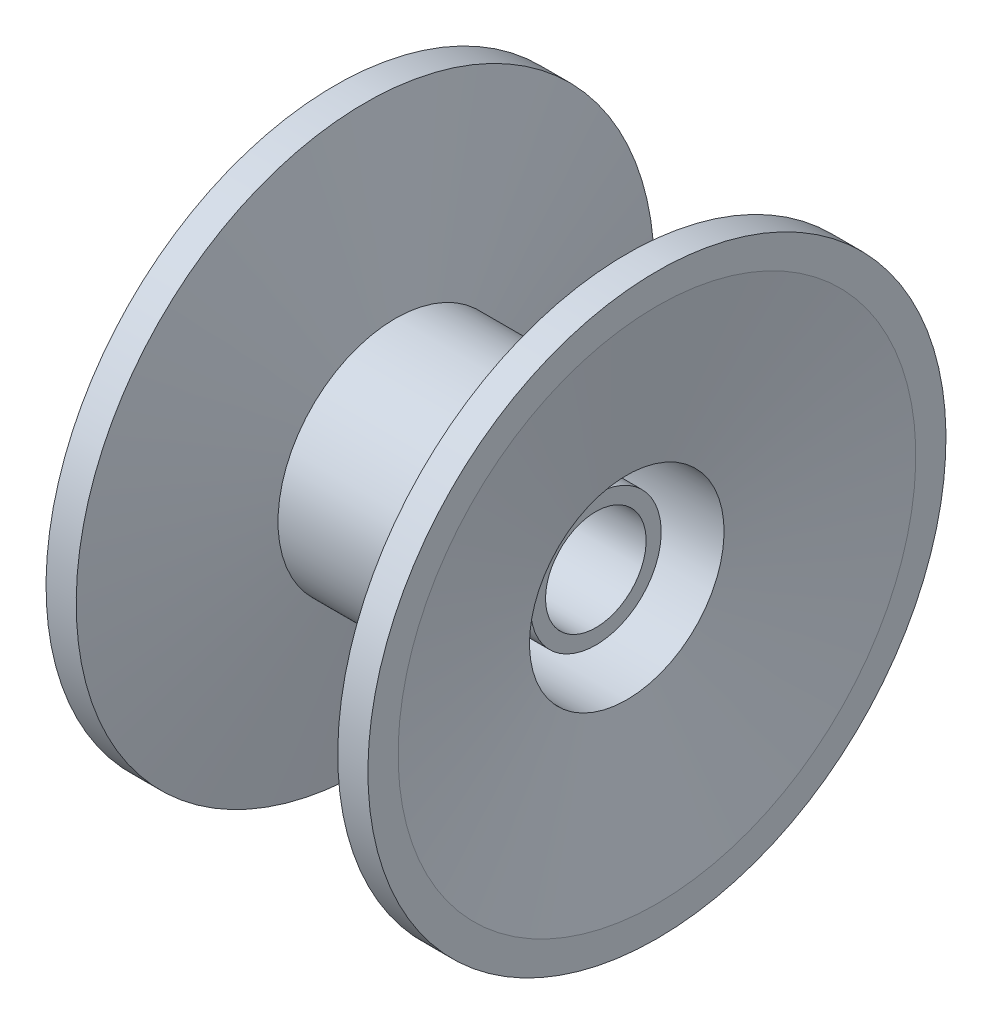
ISO-10303-21;
HEADER;
FILE_DESCRIPTION(('STEP AP214'),'2;1');
FILE_NAME('part.step','',(''),(''),'','','');
FILE_SCHEMA(('AUTOMOTIVE_DESIGN { 1 0 10303 214 1 1 1 1 }'));
ENDSEC;
DATA;
#1=APPLICATION_CONTEXT('core data for automotive mechanical design processes');
#2=APPLICATION_PROTOCOL_DEFINITION('international standard','automotive_design',2000,#1);
#3=PRODUCT_CONTEXT('',#1,'mechanical');
#4=PRODUCT('Part','Part','',(#3));
#5=PRODUCT_RELATED_PRODUCT_CATEGORY('part','',(#4));
#6=PRODUCT_DEFINITION_FORMATION('','',#4);
#7=PRODUCT_DEFINITION_CONTEXT('part definition',#1,'design');
#8=PRODUCT_DEFINITION('design','',#6,#7);
#9=PRODUCT_DEFINITION_SHAPE('','',#8);
#10=(LENGTH_UNIT() NAMED_UNIT(*) SI_UNIT(.MILLI.,.METRE.));
#11=(NAMED_UNIT(*) PLANE_ANGLE_UNIT() SI_UNIT($,.RADIAN.));
#12=(NAMED_UNIT(*) SI_UNIT($,.STERADIAN.) SOLID_ANGLE_UNIT());
#13=UNCERTAINTY_MEASURE_WITH_UNIT(LENGTH_MEASURE(1.E-05),#10,'distance_accuracy_value','');
#14=(GEOMETRIC_REPRESENTATION_CONTEXT(3) GLOBAL_UNCERTAINTY_ASSIGNED_CONTEXT((#13)) GLOBAL_UNIT_ASSIGNED_CONTEXT((#10,
#11,#12)) REPRESENTATION_CONTEXT('',''));
#15=CARTESIAN_POINT('',(0.,0.,0.));
#16=DIRECTION('',(0.,0.,1.));
#17=DIRECTION('',(1.,0.,0.));
#18=AXIS2_PLACEMENT_3D('',#15,#16,#17);
#19=CARTESIAN_POINT('',(5.47402550882856,0.,0.));
#20=DIRECTION('',(-1.,0.,0.));
#21=DIRECTION('',(0.,0.,1.));
#22=AXIS2_PLACEMENT_3D('',#19,#20,#21);
#23=DEGENERATE_TOROIDAL_SURFACE('',#22,5.60967418540784,13.1304799413457,.T.);
#24=CARTESIAN_POINT('',(-7.60233564153834,0.,0.));
#25=DIRECTION('',(-1.,0.,0.));
#26=DIRECTION('',(0.,0.,1.));
#27=AXIS2_PLACEMENT_3D('',#24,#25,#26);
#28=CIRCLE('',#27,4.41875749845787);
#29=CARTESIAN_POINT('',(-7.60233564153834,0.,4.41875749845787));
#30=VERTEX_POINT('',#29);
#31=EDGE_CURVE('E11',#30,#30,#28,.T.);
#32=ORIENTED_EDGE('',*,*,#31,.F.);
#33=EDGE_LOOP('',(#32));
#34=FACE_BOUND('',#33,.T.);
#35=CARTESIAN_POINT('',(-7.25,0.,0.));
#36=DIRECTION('',(-1.,0.,0.));
#37=DIRECTION('',(0.,0.,1.));
#38=AXIS2_PLACEMENT_3D('',#35,#36,#37);
#39=CIRCLE('',#38,8.85138335508371);
#40=CARTESIAN_POINT('',(-7.25,0.,8.85138335508371));
#41=VERTEX_POINT('',#40);
#42=EDGE_CURVE('E79',#41,#41,#39,.T.);
#43=ORIENTED_EDGE('',*,*,#42,.T.);
#44=EDGE_LOOP('',(#43));
#45=FACE_BOUND('',#44,.T.);
#46=ADVANCED_FACE('F45',(#34,#45),#23,.T.);
#47=CARTESIAN_POINT('',(-7.60233564153834,0.,0.));
#48=DIRECTION('',(-1.,0.,0.));
#49=DIRECTION('',(0.,0.,1.));
#50=AXIS2_PLACEMENT_3D('',#47,#48,#49);
#51=CONICAL_SURFACE('',#50,4.41875749845787,1.28479183864386);
#52=CARTESIAN_POINT('',(-7.03809308544061,0.,0.));
#53=DIRECTION('',(-1.,0.,0.));
#54=DIRECTION('',(0.,0.,1.));
#55=AXIS2_PLACEMENT_3D('',#52,#53,#54);
#56=CIRCLE('',#55,2.5);
#57=CARTESIAN_POINT('',(-7.03809308544061,0.,2.5));
#58=VERTEX_POINT('',#57);
#59=EDGE_CURVE('E51',#58,#58,#56,.T.);
#60=ORIENTED_EDGE('',*,*,#59,.F.);
#61=EDGE_LOOP('',(#60));
#62=FACE_BOUND('',#61,.T.);
#63=ORIENTED_EDGE('',*,*,#31,.T.);
#64=EDGE_LOOP('',(#63));
#65=FACE_BOUND('',#64,.T.);
#66=ADVANCED_FACE('F131',(#62,#65),#51,.F.);
#67=CARTESIAN_POINT('',(-5.53809308544061,0.,0.));
#68=DIRECTION('',(-1.,0.,0.));
#69=DIRECTION('',(0.,0.,1.));
#70=AXIS2_PLACEMENT_3D('',#67,#68,#69);
#71=CYLINDRICAL_SURFACE('',#70,2.5);
#72=CARTESIAN_POINT('',(-5.53809308544061,0.,0.));
#73=DIRECTION('',(-1.,0.,0.));
#74=DIRECTION('',(0.,0.,1.));
#75=AXIS2_PLACEMENT_3D('',#72,#73,#74);
#76=CIRCLE('',#75,2.5);
#77=CARTESIAN_POINT('',(-5.53809308544061,0.,2.5));
#78=VERTEX_POINT('',#77);
#79=EDGE_CURVE('E55',#78,#78,#76,.T.);
#80=ORIENTED_EDGE('',*,*,#79,.F.);
#81=EDGE_LOOP('',(#80));
#82=FACE_BOUND('',#81,.T.);
#83=ORIENTED_EDGE('',*,*,#59,.T.);
#84=EDGE_LOOP('',(#83));
#85=FACE_BOUND('',#84,.T.);
#86=ADVANCED_FACE('F127',(#82,#85),#71,.F.);
#87=CARTESIAN_POINT('',(-5.53809308544061,2.5,0.));
#88=DIRECTION('',(1.,0.,0.));
#89=DIRECTION('',(0.,0.,-1.));
#90=AXIS2_PLACEMENT_3D('',#87,#88,#89);
#91=PLANE('',#90);
#92=ORIENTED_EDGE('',*,*,#79,.T.);
#93=EDGE_LOOP('',(#92));
#94=FACE_BOUND('',#93,.T.);
#95=ADVANCED_FACE('F122',(#94),#91,.F.);
#96=CARTESIAN_POINT('',(-4.78809308544061,0.,0.));
#97=DIRECTION('',(-1.,0.,0.));
#98=DIRECTION('',(0.,0.,1.));
#99=AXIS2_PLACEMENT_3D('',#96,#97,#98);
#100=PLANE('',#99);
#101=CARTESIAN_POINT('',(-4.78809308544061,0.,0.));
#102=DIRECTION('',(-1.,0.,0.));
#103=DIRECTION('',(0.,0.,1.));
#104=AXIS2_PLACEMENT_3D('',#101,#102,#103);
#105=CIRCLE('',#104,2.5);
#106=CARTESIAN_POINT('',(-4.78809308544061,0.,2.5));
#107=VERTEX_POINT('',#106);
#108=EDGE_CURVE('E59',#107,#107,#105,.T.);
#109=ORIENTED_EDGE('',*,*,#108,.F.);
#110=EDGE_LOOP('',(#109));
#111=FACE_BOUND('',#110,.T.);
#112=ADVANCED_FACE('F117',(#111),#100,.F.);
#113=CARTESIAN_POINT('',(-5.53809308544061,0.,0.));
#114=DIRECTION('',(-1.,0.,0.));
#115=DIRECTION('',(0.,0.,1.));
#116=AXIS2_PLACEMENT_3D('',#113,#114,#115);
#117=CYLINDRICAL_SURFACE('',#116,2.5);
#118=CARTESIAN_POINT('',(4.96190691455939,0.,0.));
#119=DIRECTION('',(-1.,0.,0.));
#120=DIRECTION('',(0.,0.,1.));
#121=AXIS2_PLACEMENT_3D('',#118,#119,#120);
#122=CIRCLE('',#121,2.5);
#123=CARTESIAN_POINT('',(4.96190691455939,0.,2.5));
#124=VERTEX_POINT('',#123);
#125=EDGE_CURVE('E64',#124,#124,#122,.T.);
#126=ORIENTED_EDGE('',*,*,#125,.F.);
#127=EDGE_LOOP('',(#126));
#128=FACE_BOUND('',#127,.T.);
#129=ORIENTED_EDGE('',*,*,#108,.T.);
#130=EDGE_LOOP('',(#129));
#131=FACE_BOUND('',#130,.T.);
#132=ADVANCED_FACE('F111',(#128,#131),#117,.F.);
#133=CARTESIAN_POINT('',(4.96190691455939,3.25,0.));
#134=DIRECTION('',(-1.,0.,0.));
#135=DIRECTION('',(0.,0.,1.));
#136=AXIS2_PLACEMENT_3D('',#133,#134,#135);
#137=PLANE('',#136);
#138=CARTESIAN_POINT('',(4.96190691455939,0.,0.));
#139=DIRECTION('',(-1.,0.,0.));
#140=DIRECTION('',(0.,0.,1.));
#141=AXIS2_PLACEMENT_3D('',#138,#139,#140);
#142=CIRCLE('',#141,3.25);
#143=CARTESIAN_POINT('',(4.96190691455939,0.,3.25));
#144=VERTEX_POINT('',#143);
#145=EDGE_CURVE('E67',#144,#144,#142,.T.);
#146=ORIENTED_EDGE('',*,*,#145,.F.);
#147=EDGE_LOOP('',(#146));
#148=FACE_BOUND('',#147,.T.);
#149=ORIENTED_EDGE('',*,*,#125,.T.);
#150=EDGE_LOOP('',(#149));
#151=FACE_BOUND('',#150,.T.);
#152=ADVANCED_FACE('F105',(#148,#151),#137,.F.);
#153=CARTESIAN_POINT('',(-5.53809308544061,0.,0.));
#154=DIRECTION('',(-1.,0.,0.));
#155=DIRECTION('',(0.,0.,1.));
#156=AXIS2_PLACEMENT_3D('',#153,#154,#155);
#157=CYLINDRICAL_SURFACE('',#156,3.25);
#158=CARTESIAN_POINT('',(-6.28809308544061,0.,0.));
#159=DIRECTION('',(-1.,0.,0.));
#160=DIRECTION('',(0.,0.,1.));
#161=AXIS2_PLACEMENT_3D('',#158,#159,#160);
#162=CIRCLE('',#161,3.25);
#163=CARTESIAN_POINT('',(-6.28809308544061,0.,3.25));
#164=VERTEX_POINT('',#163);
#165=EDGE_CURVE('E70',#164,#164,#162,.T.);
#166=ORIENTED_EDGE('',*,*,#165,.F.);
#167=EDGE_LOOP('',(#166));
#168=FACE_BOUND('',#167,.T.);
#169=ORIENTED_EDGE('',*,*,#145,.T.);
#170=EDGE_LOOP('',(#169));
#171=FACE_BOUND('',#170,.T.);
#172=ADVANCED_FACE('F99',(#168,#171),#157,.T.);
#173=CARTESIAN_POINT('',(-6.28809308544061,3.25,0.));
#174=DIRECTION('',(-1.,0.,0.));
#175=DIRECTION('',(0.,0.,1.));
#176=AXIS2_PLACEMENT_3D('',#173,#174,#175);
#177=PLANE('',#176);
#178=CARTESIAN_POINT('',(-6.28809308544061,0.,0.));
#179=DIRECTION('',(-1.,0.,0.));
#180=DIRECTION('',(0.,0.,1.));
#181=AXIS2_PLACEMENT_3D('',#178,#179,#180);
#182=CIRCLE('',#181,4.41875749845787);
#183=CARTESIAN_POINT('',(-6.28809308544061,0.,4.41875749845787));
#184=VERTEX_POINT('',#183);
#185=EDGE_CURVE('E73',#184,#184,#182,.T.);
#186=ORIENTED_EDGE('',*,*,#185,.F.);
#187=EDGE_LOOP('',(#186));
#188=FACE_BOUND('',#187,.T.);
#189=ORIENTED_EDGE('',*,*,#165,.T.);
#190=EDGE_LOOP('',(#189));
#191=FACE_BOUND('',#190,.T.);
#192=ADVANCED_FACE('F93',(#188,#191),#177,.F.);
#193=CARTESIAN_POINT('',(6.13574169130121,0.,0.));
#194=DIRECTION('',(-1.,0.,0.));
#195=DIRECTION('',(0.,0.,1.));
#196=AXIS2_PLACEMENT_3D('',#193,#194,#195);
#197=DEGENERATE_TOROIDAL_SURFACE('',#196,9.12930214741197,13.2868695127773,.T.);
#198=CARTESIAN_POINT('',(-7.11228971316297,0.,0.));
#199=DIRECTION('',(-1.,0.,0.));
#200=DIRECTION('',(0.,0.,1.));
#201=AXIS2_PLACEMENT_3D('',#198,#199,#200);
#202=CIRCLE('',#201,8.11413449825227);
#203=CARTESIAN_POINT('',(-7.11228971316297,0.,8.11413449825227));
#204=VERTEX_POINT('',#203);
#205=EDGE_CURVE('E76',#204,#204,#202,.T.);
#206=ORIENTED_EDGE('',*,*,#205,.F.);
#207=EDGE_LOOP('',(#206));
#208=FACE_BOUND('',#207,.T.);
#209=ORIENTED_EDGE('',*,*,#185,.T.);
#210=EDGE_LOOP('',(#209));
#211=FACE_BOUND('',#210,.T.);
#212=ADVANCED_FACE('F87',(#208,#211),#197,.F.);
#213=CARTESIAN_POINT('',(-7.11228971316297,0.,0.));
#214=DIRECTION('',(-1.,0.,0.));
#215=DIRECTION('',(0.,0.,1.));
#216=AXIS2_PLACEMENT_3D('',#213,#214,#215);
#217=CONICAL_SURFACE('',#216,8.11413449825227,1.38613491152783);
#218=ORIENTED_EDGE('',*,*,#42,.F.);
#219=EDGE_LOOP('',(#218));
#220=FACE_BOUND('',#219,.T.);
#221=ORIENTED_EDGE('',*,*,#205,.T.);
#222=EDGE_LOOP('',(#221));
#223=FACE_BOUND('',#222,.T.);
#224=ADVANCED_FACE('F84',(#220,#223),#217,.T.);
#225=CLOSED_SHELL('',(#46,#66,#86,#95,#112,#132,#152,#172,#192,#212,#224));
#226=MANIFOLD_SOLID_BREP('B2',#225);
#227=CARTESIAN_POINT('',(-5.,0.,0.));
#228=DIRECTION('',(-1.,0.,0.));
#229=DIRECTION('',(0.,-1.,0.));
#230=AXIS2_PLACEMENT_3D('',#227,#228,#229);
#231=CYLINDRICAL_SURFACE('',#230,4.83616666122877);
#232=CARTESIAN_POINT('',(6.5,0.,0.));
#233=DIRECTION('',(-1.,0.,0.));
#234=DIRECTION('',(0.,-1.,0.));
#235=AXIS2_PLACEMENT_3D('',#232,#233,#234);
#236=CIRCLE('',#235,4.83616666122877);
#237=CARTESIAN_POINT('',(6.5,-4.83616666122877,0.));
#238=VERTEX_POINT('',#237);
#239=EDGE_CURVE('E44',#238,#238,#236,.T.);
#240=ORIENTED_EDGE('',*,*,#239,.F.);
#241=EDGE_LOOP('',(#240));
#242=FACE_BOUND('',#241,.T.);
#243=CARTESIAN_POINT('',(-6.5,0.,0.));
#244=DIRECTION('',(-1.,0.,0.));
#245=DIRECTION('',(0.,-1.,0.));
#246=AXIS2_PLACEMENT_3D('',#243,#244,#245);
#247=CIRCLE('',#246,4.83616666122877);
#248=CARTESIAN_POINT('',(-6.5,-4.83616666122877,0.));
#249=VERTEX_POINT('',#248);
#250=EDGE_CURVE('E242',#249,#249,#247,.T.);
#251=ORIENTED_EDGE('',*,*,#250,.T.);
#252=EDGE_LOOP('',(#251));
#253=FACE_BOUND('',#252,.T.);
#254=ADVANCED_FACE('F208',(#242,#253),#231,.F.);
#255=CARTESIAN_POINT('',(8.,0.,0.));
#256=DIRECTION('',(1.,0.,0.));
#257=DIRECTION('',(0.,1.,0.));
#258=AXIS2_PLACEMENT_3D('',#255,#256,#257);
#259=CONICAL_SURFACE('',#258,12.8666000489386,1.38613491152784);
#260=ORIENTED_EDGE('',*,*,#239,.T.);
#261=EDGE_LOOP('',(#260));
#262=FACE_BOUND('',#261,.T.);
#263=CARTESIAN_POINT('',(8.,0.,0.));
#264=DIRECTION('',(-1.,0.,0.));
#265=DIRECTION('',(0.,-1.,0.));
#266=AXIS2_PLACEMENT_3D('',#263,#264,#265);
#267=CIRCLE('',#266,12.8666000489386);
#268=CARTESIAN_POINT('',(8.00000000000001,-12.8666000489386,0.));
#269=VERTEX_POINT('',#268);
#270=EDGE_CURVE('E214',#269,#269,#267,.T.);
#271=ORIENTED_EDGE('',*,*,#270,.F.);
#272=EDGE_LOOP('',(#271));
#273=FACE_BOUND('',#272,.T.);
#274=ADVANCED_FACE('F271',(#262,#273),#259,.F.);
#275=CARTESIAN_POINT('',(8.,0.,0.));
#276=DIRECTION('',(1.,0.,0.));
#277=DIRECTION('',(0.,1.,0.));
#278=AXIS2_PLACEMENT_3D('',#275,#276,#277);
#279=PLANE('',#278);
#280=ORIENTED_EDGE('',*,*,#270,.T.);
#281=EDGE_LOOP('',(#280));
#282=FACE_BOUND('',#281,.T.);
#283=CARTESIAN_POINT('',(8.,0.,0.));
#284=DIRECTION('',(-1.,0.,0.));
#285=DIRECTION('',(0.,-1.,0.));
#286=AXIS2_PLACEMENT_3D('',#283,#284,#285);
#287=CIRCLE('',#286,14.3666000489387);
#288=CARTESIAN_POINT('',(8.,-14.3666000489387,0.));
#289=VERTEX_POINT('',#288);
#290=EDGE_CURVE('E218',#289,#289,#287,.T.);
#291=ORIENTED_EDGE('',*,*,#290,.F.);
#292=EDGE_LOOP('',(#291));
#293=FACE_BOUND('',#292,.T.);
#294=ADVANCED_FACE('F276',(#282,#293),#279,.T.);
#295=CARTESIAN_POINT('',(-5.,0.,0.));
#296=DIRECTION('',(-1.,0.,0.));
#297=DIRECTION('',(0.,-1.,0.));
#298=AXIS2_PLACEMENT_3D('',#295,#296,#297);
#299=CYLINDRICAL_SURFACE('',#298,14.3666000489387);
#300=CARTESIAN_POINT('',(6.5,0.,0.));
#301=DIRECTION('',(-1.,0.,0.));
#302=DIRECTION('',(0.,-1.,0.));
#303=AXIS2_PLACEMENT_3D('',#300,#301,#302);
#304=CIRCLE('',#303,14.3666000489387);
#305=CARTESIAN_POINT('',(6.50000000000001,-14.3666000489387,0.));
#306=VERTEX_POINT('',#305);
#307=EDGE_CURVE('E222',#306,#306,#304,.T.);
#308=ORIENTED_EDGE('',*,*,#307,.F.);
#309=EDGE_LOOP('',(#308));
#310=FACE_BOUND('',#309,.T.);
#311=ORIENTED_EDGE('',*,*,#290,.T.);
#312=EDGE_LOOP('',(#311));
#313=FACE_BOUND('',#312,.T.);
#314=ADVANCED_FACE('F280',(#310,#313),#299,.T.);
#315=CARTESIAN_POINT('',(6.5,0.,0.));
#316=DIRECTION('',(1.,0.,0.));
#317=DIRECTION('',(0.,1.,0.));
#318=AXIS2_PLACEMENT_3D('',#315,#316,#317);
#319=CONICAL_SURFACE('',#318,14.3666000489387,1.39673476020517);
#320=CARTESIAN_POINT('',(5.,0.,0.));
#321=DIRECTION('',(-1.,0.,0.));
#322=DIRECTION('',(0.,-1.,0.));
#323=AXIS2_PLACEMENT_3D('',#320,#321,#322);
#324=CIRCLE('',#323,5.83616666122877);
#325=CARTESIAN_POINT('',(5.,-5.83616666122877,0.));
#326=VERTEX_POINT('',#325);
#327=EDGE_CURVE('E227',#326,#326,#324,.T.);
#328=ORIENTED_EDGE('',*,*,#327,.F.);
#329=EDGE_LOOP('',(#328));
#330=FACE_BOUND('',#329,.T.);
#331=ORIENTED_EDGE('',*,*,#307,.T.);
#332=EDGE_LOOP('',(#331));
#333=FACE_BOUND('',#332,.T.);
#334=ADVANCED_FACE('F286',(#330,#333),#319,.T.);
#335=CARTESIAN_POINT('',(-5.,0.,0.));
#336=DIRECTION('',(-1.,0.,0.));
#337=DIRECTION('',(0.,-1.,0.));
#338=AXIS2_PLACEMENT_3D('',#335,#336,#337);
#339=CYLINDRICAL_SURFACE('',#338,5.83616666122877);
#340=ORIENTED_EDGE('',*,*,#327,.T.);
#341=EDGE_LOOP('',(#340));
#342=FACE_BOUND('',#341,.T.);
#343=CARTESIAN_POINT('',(-5.,0.,0.));
#344=DIRECTION('',(-1.,0.,0.));
#345=DIRECTION('',(0.,-1.,0.));
#346=AXIS2_PLACEMENT_3D('',#343,#344,#345);
#347=CIRCLE('',#346,5.83616666122877);
#348=CARTESIAN_POINT('',(-5.,-5.83616666122877,0.));
#349=VERTEX_POINT('',#348);
#350=EDGE_CURVE('E230',#349,#349,#347,.T.);
#351=ORIENTED_EDGE('',*,*,#350,.F.);
#352=EDGE_LOOP('',(#351));
#353=FACE_BOUND('',#352,.T.);
#354=ADVANCED_FACE('F267',(#342,#353),#339,.T.);
#355=CARTESIAN_POINT('',(-6.5,0.,0.));
#356=DIRECTION('',(-1.,0.,0.));
#357=DIRECTION('',(0.,-1.,0.));
#358=AXIS2_PLACEMENT_3D('',#355,#356,#357);
#359=CONICAL_SURFACE('',#358,14.3666000489387,1.39673476020517);
#360=ORIENTED_EDGE('',*,*,#350,.T.);
#361=EDGE_LOOP('',(#360));
#362=FACE_BOUND('',#361,.T.);
#363=CARTESIAN_POINT('',(-6.5,0.,0.));
#364=DIRECTION('',(-1.,0.,0.));
#365=DIRECTION('',(0.,-1.,0.));
#366=AXIS2_PLACEMENT_3D('',#363,#364,#365);
#367=CIRCLE('',#366,14.3666000489387);
#368=CARTESIAN_POINT('',(-6.5,-14.3666000489387,0.));
#369=VERTEX_POINT('',#368);
#370=EDGE_CURVE('E233',#369,#369,#367,.T.);
#371=ORIENTED_EDGE('',*,*,#370,.F.);
#372=EDGE_LOOP('',(#371));
#373=FACE_BOUND('',#372,.T.);
#374=ADVANCED_FACE('F261',(#362,#373),#359,.T.);
#375=CARTESIAN_POINT('',(-5.,0.,0.));
#376=DIRECTION('',(-1.,0.,0.));
#377=DIRECTION('',(0.,-1.,0.));
#378=AXIS2_PLACEMENT_3D('',#375,#376,#377);
#379=CYLINDRICAL_SURFACE('',#378,14.3666000489387);
#380=ORIENTED_EDGE('',*,*,#370,.T.);
#381=EDGE_LOOP('',(#380));
#382=FACE_BOUND('',#381,.T.);
#383=CARTESIAN_POINT('',(-8.,0.,0.));
#384=DIRECTION('',(-1.,0.,0.));
#385=DIRECTION('',(0.,-1.,0.));
#386=AXIS2_PLACEMENT_3D('',#383,#384,#385);
#387=CIRCLE('',#386,14.3666000489387);
#388=CARTESIAN_POINT('',(-8.,-14.3666000489387,0.));
#389=VERTEX_POINT('',#388);
#390=EDGE_CURVE('E236',#389,#389,#387,.T.);
#391=ORIENTED_EDGE('',*,*,#390,.F.);
#392=EDGE_LOOP('',(#391));
#393=FACE_BOUND('',#392,.T.);
#394=ADVANCED_FACE('F256',(#382,#393),#379,.T.);
#395=CARTESIAN_POINT('',(-8.,0.,0.));
#396=DIRECTION('',(1.,0.,0.));
#397=DIRECTION('',(0.,1.,0.));
#398=AXIS2_PLACEMENT_3D('',#395,#396,#397);
#399=PLANE('',#398);
#400=CARTESIAN_POINT('',(-8.,0.,0.));
#401=DIRECTION('',(-1.,0.,0.));
#402=DIRECTION('',(0.,-1.,0.));
#403=AXIS2_PLACEMENT_3D('',#400,#401,#402);
#404=CIRCLE('',#403,12.8666000489387);
#405=CARTESIAN_POINT('',(-8.,-12.8666000489387,0.));
#406=VERTEX_POINT('',#405);
#407=EDGE_CURVE('E239',#406,#406,#404,.T.);
#408=ORIENTED_EDGE('',*,*,#407,.F.);
#409=EDGE_LOOP('',(#408));
#410=FACE_BOUND('',#409,.T.);
#411=ORIENTED_EDGE('',*,*,#390,.T.);
#412=EDGE_LOOP('',(#411));
#413=FACE_BOUND('',#412,.T.);
#414=ADVANCED_FACE('F250',(#410,#413),#399,.F.);
#415=CARTESIAN_POINT('',(-8.,0.,0.));
#416=DIRECTION('',(-1.,0.,0.));
#417=DIRECTION('',(0.,-1.,0.));
#418=AXIS2_PLACEMENT_3D('',#415,#416,#417);
#419=CONICAL_SURFACE('',#418,12.8666000489387,1.38613491152784);
#420=ORIENTED_EDGE('',*,*,#250,.F.);
#421=EDGE_LOOP('',(#420));
#422=FACE_BOUND('',#421,.T.);
#423=ORIENTED_EDGE('',*,*,#407,.T.);
#424=EDGE_LOOP('',(#423));
#425=FACE_BOUND('',#424,.T.);
#426=ADVANCED_FACE('F247',(#422,#425),#419,.F.);
#427=CLOSED_SHELL('',(#254,#274,#294,#314,#334,#354,#374,#394,#414,#426));
#428=MANIFOLD_SOLID_BREP('B6',#427);
#429=ADVANCED_BREP_SHAPE_REPRESENTATION('',(#18,#226,#428),#14);
#430=SHAPE_DEFINITION_REPRESENTATION(#9,#429);
ENDSEC;
END-ISO-10303-21;
